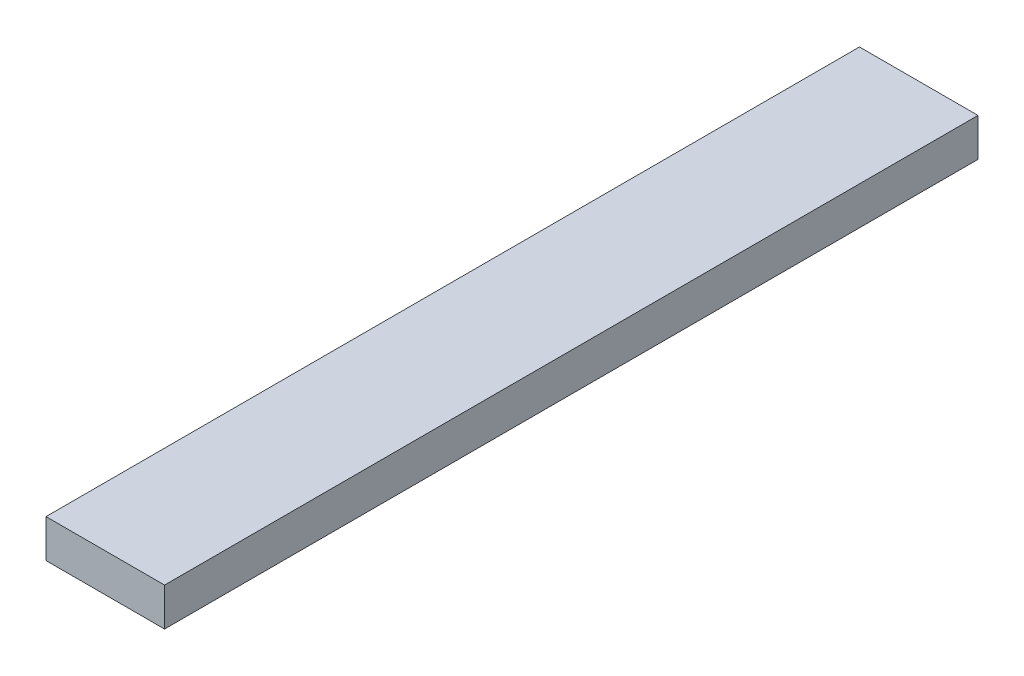
ISO-10303-21;
HEADER;
FILE_DESCRIPTION(('STEP AP214'),'2;1');
FILE_NAME('part.step','',(''),(''),'','','');
FILE_SCHEMA(('AUTOMOTIVE_DESIGN { 1 0 10303 214 1 1 1 1 }'));
ENDSEC;
DATA;
#1=APPLICATION_CONTEXT('core data for automotive mechanical design processes');
#2=APPLICATION_PROTOCOL_DEFINITION('international standard','automotive_design',2000,#1);
#3=PRODUCT_CONTEXT('',#1,'mechanical');
#4=PRODUCT('Part','Part','',(#3));
#5=PRODUCT_RELATED_PRODUCT_CATEGORY('part','',(#4));
#6=PRODUCT_DEFINITION_FORMATION('','',#4);
#7=PRODUCT_DEFINITION_CONTEXT('part definition',#1,'design');
#8=PRODUCT_DEFINITION('design','',#6,#7);
#9=PRODUCT_DEFINITION_SHAPE('','',#8);
#10=(LENGTH_UNIT() NAMED_UNIT(*) SI_UNIT(.MILLI.,.METRE.));
#11=(NAMED_UNIT(*) PLANE_ANGLE_UNIT() SI_UNIT($,.RADIAN.));
#12=(NAMED_UNIT(*) SI_UNIT($,.STERADIAN.) SOLID_ANGLE_UNIT());
#13=UNCERTAINTY_MEASURE_WITH_UNIT(LENGTH_MEASURE(1.E-05),#10,'distance_accuracy_value','');
#14=(GEOMETRIC_REPRESENTATION_CONTEXT(3) GLOBAL_UNCERTAINTY_ASSIGNED_CONTEXT((#13)) GLOBAL_UNIT_ASSIGNED_CONTEXT((#10,
#11,#12)) REPRESENTATION_CONTEXT('',''));
#15=CARTESIAN_POINT('',(0.,0.,0.));
#16=DIRECTION('',(0.,0.,1.));
#17=DIRECTION('',(1.,0.,0.));
#18=AXIS2_PLACEMENT_3D('',#15,#16,#17);
#19=CARTESIAN_POINT('',(0.,0.,610.));
#20=DIRECTION('',(1.,0.,0.));
#21=DIRECTION('',(0.,0.,-1.));
#22=AXIS2_PLACEMENT_3D('',#19,#20,#21);
#23=PLANE('',#22);
#24=DIRECTION('',(0.,-1.,0.));
#25=VECTOR('',#24,1.);
#26=CARTESIAN_POINT('',(0.,0.,0.));
#27=LINE('',#26,#25);
#28=CARTESIAN_POINT('',(0.,28.575,0.));
#29=VERTEX_POINT('',#28);
#30=CARTESIAN_POINT('',(0.,0.,0.));
#31=VERTEX_POINT('',#30);
#32=EDGE_CURVE('E100',#29,#31,#27,.T.);
#33=ORIENTED_EDGE('',*,*,#32,.T.);
#34=DIRECTION('',(0.,0.,-1.));
#35=VECTOR('',#34,1.);
#36=CARTESIAN_POINT('',(0.,0.,610.));
#37=LINE('',#36,#35);
#38=CARTESIAN_POINT('',(0.,0.,610.));
#39=VERTEX_POINT('',#38);
#40=EDGE_CURVE('E11',#39,#31,#37,.T.);
#41=ORIENTED_EDGE('',*,*,#40,.F.);
#42=DIRECTION('',(0.,-1.,0.));
#43=VECTOR('',#42,1.);
#44=CARTESIAN_POINT('',(0.,0.,610.));
#45=LINE('',#44,#43);
#46=CARTESIAN_POINT('',(0.,28.575,610.));
#47=VERTEX_POINT('',#46);
#48=EDGE_CURVE('E88',#47,#39,#45,.T.);
#49=ORIENTED_EDGE('',*,*,#48,.F.);
#50=DIRECTION('',(0.,0.,-1.));
#51=VECTOR('',#50,1.);
#52=CARTESIAN_POINT('',(0.,28.575,610.));
#53=LINE('',#52,#51);
#54=EDGE_CURVE('E96',#47,#29,#53,.T.);
#55=ORIENTED_EDGE('',*,*,#54,.T.);
#56=EDGE_LOOP('',(#33,#41,#49,#55));
#57=FACE_BOUND('',#56,.T.);
#58=ADVANCED_FACE('F37',(#57),#23,.F.);
#59=CARTESIAN_POINT('',(0.,0.,610.));
#60=DIRECTION('',(0.,1.,0.));
#61=DIRECTION('',(0.,0.,1.));
#62=AXIS2_PLACEMENT_3D('',#59,#60,#61);
#63=PLANE('',#62);
#64=DIRECTION('',(1.,0.,0.));
#65=VECTOR('',#64,1.);
#66=CARTESIAN_POINT('',(0.,0.,0.));
#67=LINE('',#66,#65);
#68=CARTESIAN_POINT('',(88.9,0.,0.));
#69=VERTEX_POINT('',#68);
#70=EDGE_CURVE('E92',#31,#69,#67,.T.);
#71=ORIENTED_EDGE('',*,*,#70,.T.);
#72=DIRECTION('',(0.,0.,-1.));
#73=VECTOR('',#72,1.);
#74=CARTESIAN_POINT('',(88.9,0.,610.));
#75=LINE('',#74,#73);
#76=CARTESIAN_POINT('',(88.9,0.,610.));
#77=VERTEX_POINT('',#76);
#78=EDGE_CURVE('E45',#77,#69,#75,.T.);
#79=ORIENTED_EDGE('',*,*,#78,.F.);
#80=DIRECTION('',(1.,0.,0.));
#81=VECTOR('',#80,1.);
#82=CARTESIAN_POINT('',(0.,0.,610.));
#83=LINE('',#82,#81);
#84=EDGE_CURVE('E83',#39,#77,#83,.T.);
#85=ORIENTED_EDGE('',*,*,#84,.F.);
#86=ORIENTED_EDGE('',*,*,#40,.T.);
#87=EDGE_LOOP('',(#71,#79,#85,#86));
#88=FACE_BOUND('',#87,.T.);
#89=ADVANCED_FACE('F91',(#88),#63,.F.);
#90=CARTESIAN_POINT('',(88.9,0.,610.));
#91=DIRECTION('',(-1.,0.,0.));
#92=DIRECTION('',(0.,0.,1.));
#93=AXIS2_PLACEMENT_3D('',#90,#91,#92);
#94=PLANE('',#93);
#95=DIRECTION('',(0.,1.,0.));
#96=VECTOR('',#95,1.);
#97=CARTESIAN_POINT('',(88.9,0.,0.));
#98=LINE('',#97,#96);
#99=CARTESIAN_POINT('',(88.9,28.575,0.));
#100=VERTEX_POINT('',#99);
#101=EDGE_CURVE('E70',#69,#100,#98,.T.);
#102=ORIENTED_EDGE('',*,*,#101,.T.);
#103=DIRECTION('',(0.,0.,-1.));
#104=VECTOR('',#103,1.);
#105=CARTESIAN_POINT('',(88.9,28.575,610.));
#106=LINE('',#105,#104);
#107=CARTESIAN_POINT('',(88.9,28.575,610.));
#108=VERTEX_POINT('',#107);
#109=EDGE_CURVE('E93',#108,#100,#106,.T.);
#110=ORIENTED_EDGE('',*,*,#109,.F.);
#111=DIRECTION('',(0.,1.,0.));
#112=VECTOR('',#111,1.);
#113=CARTESIAN_POINT('',(88.9,0.,610.));
#114=LINE('',#113,#112);
#115=EDGE_CURVE('E86',#77,#108,#114,.T.);
#116=ORIENTED_EDGE('',*,*,#115,.F.);
#117=ORIENTED_EDGE('',*,*,#78,.T.);
#118=EDGE_LOOP('',(#102,#110,#116,#117));
#119=FACE_BOUND('',#118,.T.);
#120=ADVANCED_FACE('F94',(#119),#94,.F.);
#121=CARTESIAN_POINT('',(0.,28.575,610.));
#122=DIRECTION('',(0.,-1.,0.));
#123=DIRECTION('',(0.,0.,-1.));
#124=AXIS2_PLACEMENT_3D('',#121,#122,#123);
#125=PLANE('',#124);
#126=DIRECTION('',(-1.,0.,0.));
#127=VECTOR('',#126,1.);
#128=CARTESIAN_POINT('',(0.,28.575,0.));
#129=LINE('',#128,#127);
#130=EDGE_CURVE('E76',#100,#29,#129,.T.);
#131=ORIENTED_EDGE('',*,*,#130,.T.);
#132=ORIENTED_EDGE('',*,*,#54,.F.);
#133=DIRECTION('',(-1.,0.,0.));
#134=VECTOR('',#133,1.);
#135=CARTESIAN_POINT('',(0.,28.575,610.));
#136=LINE('',#135,#134);
#137=EDGE_CURVE('E53',#108,#47,#136,.T.);
#138=ORIENTED_EDGE('',*,*,#137,.F.);
#139=ORIENTED_EDGE('',*,*,#109,.T.);
#140=EDGE_LOOP('',(#131,#132,#138,#139));
#141=FACE_BOUND('',#140,.T.);
#142=ADVANCED_FACE('F107',(#141),#125,.F.);
#143=CARTESIAN_POINT('',(0.,0.,610.));
#144=DIRECTION('',(0.,0.,-1.));
#145=DIRECTION('',(-1.,0.,0.));
#146=AXIS2_PLACEMENT_3D('',#143,#144,#145);
#147=PLANE('',#146);
#148=ORIENTED_EDGE('',*,*,#48,.T.);
#149=ORIENTED_EDGE('',*,*,#84,.T.);
#150=ORIENTED_EDGE('',*,*,#115,.T.);
#151=ORIENTED_EDGE('',*,*,#137,.T.);
#152=EDGE_LOOP('',(#148,#149,#150,#151));
#153=FACE_BOUND('',#152,.T.);
#154=ADVANCED_FACE('F84',(#153),#147,.F.);
#155=CARTESIAN_POINT('',(0.,0.,0.));
#156=DIRECTION('',(0.,0.,-1.));
#157=DIRECTION('',(-1.,0.,0.));
#158=AXIS2_PLACEMENT_3D('',#155,#156,#157);
#159=PLANE('',#158);
#160=ORIENTED_EDGE('',*,*,#32,.F.);
#161=ORIENTED_EDGE('',*,*,#130,.F.);
#162=ORIENTED_EDGE('',*,*,#101,.F.);
#163=ORIENTED_EDGE('',*,*,#70,.F.);
#164=EDGE_LOOP('',(#160,#161,#162,#163));
#165=FACE_BOUND('',#164,.T.);
#166=ADVANCED_FACE('F110',(#165),#159,.T.);
#167=CLOSED_SHELL('',(#58,#89,#120,#142,#154,#166));
#168=MANIFOLD_SOLID_BREP('B2',#167);
#169=ADVANCED_BREP_SHAPE_REPRESENTATION('',(#18,#168),#14);
#170=SHAPE_DEFINITION_REPRESENTATION(#9,#169);
ENDSEC;
END-ISO-10303-21;
